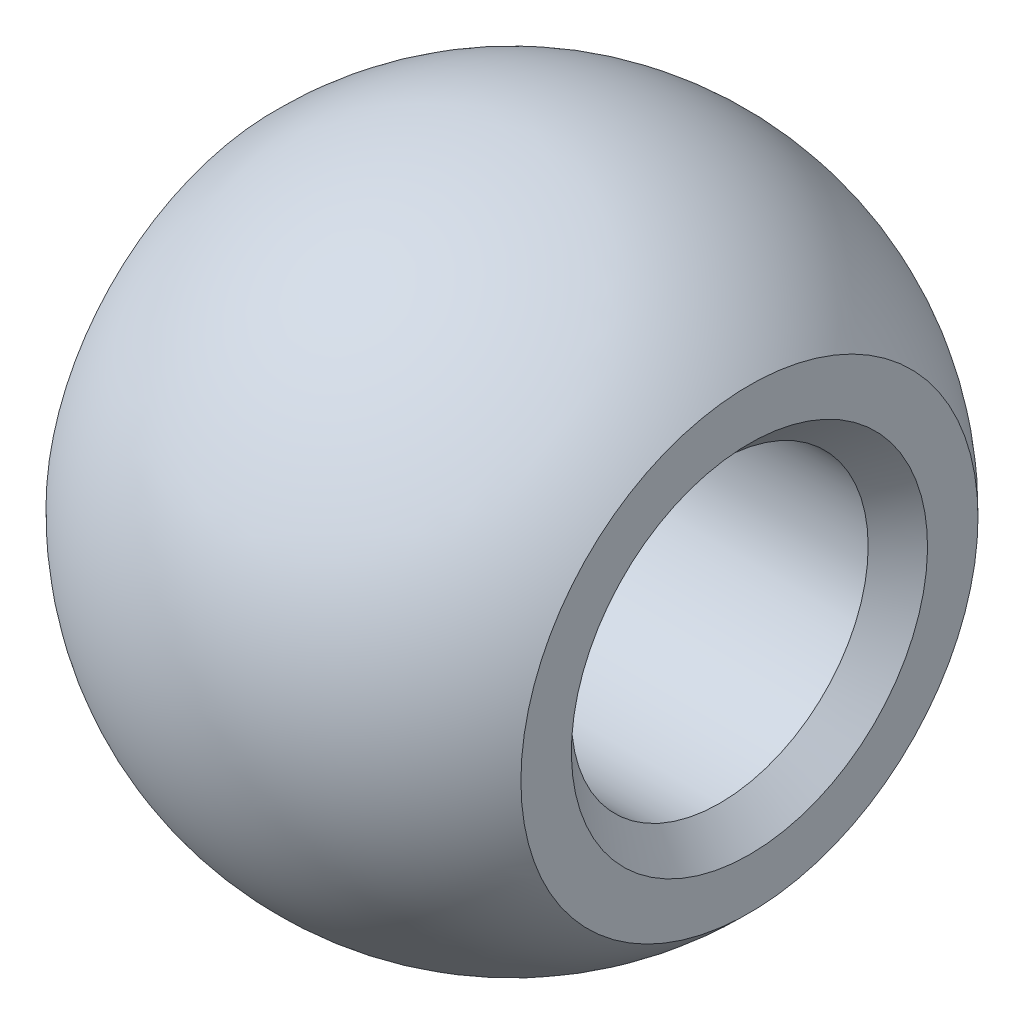
ISO-10303-21;
HEADER;
FILE_DESCRIPTION(('STEP AP214'),'2;1');
FILE_NAME('part.step','',(''),(''),'','','');
FILE_SCHEMA(('AUTOMOTIVE_DESIGN { 1 0 10303 214 1 1 1 1 }'));
ENDSEC;
DATA;
#1=APPLICATION_CONTEXT('core data for automotive mechanical design processes');
#2=APPLICATION_PROTOCOL_DEFINITION('international standard','automotive_design',2000,#1);
#3=PRODUCT_CONTEXT('',#1,'mechanical');
#4=PRODUCT('Part','Part','',(#3));
#5=PRODUCT_RELATED_PRODUCT_CATEGORY('part','',(#4));
#6=PRODUCT_DEFINITION_FORMATION('','',#4);
#7=PRODUCT_DEFINITION_CONTEXT('part definition',#1,'design');
#8=PRODUCT_DEFINITION('design','',#6,#7);
#9=PRODUCT_DEFINITION_SHAPE('','',#8);
#10=(LENGTH_UNIT() NAMED_UNIT(*) SI_UNIT(.MILLI.,.METRE.));
#11=(NAMED_UNIT(*) PLANE_ANGLE_UNIT() SI_UNIT($,.RADIAN.));
#12=(NAMED_UNIT(*) SI_UNIT($,.STERADIAN.) SOLID_ANGLE_UNIT());
#13=UNCERTAINTY_MEASURE_WITH_UNIT(LENGTH_MEASURE(1.E-05),#10,'distance_accuracy_value','');
#14=(GEOMETRIC_REPRESENTATION_CONTEXT(3) GLOBAL_UNCERTAINTY_ASSIGNED_CONTEXT((#13)) GLOBAL_UNIT_ASSIGNED_CONTEXT((#10,
#11,#12)) REPRESENTATION_CONTEXT('',''));
#15=CARTESIAN_POINT('',(0.,0.,0.));
#16=DIRECTION('',(0.,0.,1.));
#17=DIRECTION('',(1.,0.,0.));
#18=AXIS2_PLACEMENT_3D('',#15,#16,#17);
#19=CARTESIAN_POINT('',(3.75,0.,0.));
#20=DIRECTION('',(1.,0.,0.));
#21=DIRECTION('',(0.,1.,0.));
#22=AXIS2_PLACEMENT_3D('',#19,#20,#21);
#23=CONICAL_SURFACE('',#22,2.75,0.785398163397448);
#24=CARTESIAN_POINT('',(3.5,0.,0.));
#25=DIRECTION('',(-1.,0.,0.));
#26=DIRECTION('',(0.,1.,0.));
#27=AXIS2_PLACEMENT_3D('',#24,#25,#26);
#28=CIRCLE('',#27,2.5);
#29=CARTESIAN_POINT('',(3.5,-2.5,0.));
#30=VERTEX_POINT('',#29);
#31=EDGE_CURVE('E11',#30,#30,#28,.T.);
#32=ORIENTED_EDGE('',*,*,#31,.T.);
#33=EDGE_LOOP('',(#32));
#34=FACE_BOUND('',#33,.T.);
#35=CARTESIAN_POINT('',(4.,0.,0.));
#36=DIRECTION('',(1.,0.,0.));
#37=DIRECTION('',(0.,1.,0.));
#38=AXIS2_PLACEMENT_3D('',#35,#36,#37);
#39=CIRCLE('',#38,3.);
#40=CARTESIAN_POINT('',(4.,-3.,0.));
#41=VERTEX_POINT('',#40);
#42=EDGE_CURVE('E26',#41,#41,#39,.T.);
#43=ORIENTED_EDGE('',*,*,#42,.T.);
#44=EDGE_LOOP('',(#43));
#45=FACE_BOUND('',#44,.T.);
#46=ADVANCED_FACE('F16',(#34,#45),#23,.F.);
#47=CARTESIAN_POINT('',(3.,0.,0.));
#48=DIRECTION('',(1.,0.,0.));
#49=DIRECTION('',(0.,1.,0.));
#50=AXIS2_PLACEMENT_3D('',#47,#48,#49);
#51=CYLINDRICAL_SURFACE('',#50,2.5);
#52=CARTESIAN_POINT('',(-3.5,0.,0.));
#53=DIRECTION('',(1.,0.,0.));
#54=DIRECTION('',(0.,1.,0.));
#55=AXIS2_PLACEMENT_3D('',#52,#53,#54);
#56=CIRCLE('',#55,2.5);
#57=CARTESIAN_POINT('',(-3.5,-2.5,0.));
#58=VERTEX_POINT('',#57);
#59=EDGE_CURVE('E44',#58,#58,#56,.T.);
#60=ORIENTED_EDGE('',*,*,#59,.F.);
#61=EDGE_LOOP('',(#60));
#62=FACE_BOUND('',#61,.T.);
#63=ORIENTED_EDGE('',*,*,#31,.F.);
#64=EDGE_LOOP('',(#63));
#65=FACE_BOUND('',#64,.T.);
#66=ADVANCED_FACE('F45',(#62,#65),#51,.F.);
#67=CARTESIAN_POINT('',(4.,5.55180150942017,0.));
#68=DIRECTION('',(-1.,0.,0.));
#69=DIRECTION('',(0.,-1.,0.));
#70=AXIS2_PLACEMENT_3D('',#67,#68,#69);
#71=PLANE('',#70);
#72=CARTESIAN_POINT('',(4.,0.,0.));
#73=DIRECTION('',(-1.,0.,0.));
#74=DIRECTION('',(0.,0.,-1.));
#75=AXIS2_PLACEMENT_3D('',#72,#73,#74);
#76=CIRCLE('',#75,3.85);
#77=CARTESIAN_POINT('',(4.,0.,3.85));
#78=VERTEX_POINT('',#77);
#79=EDGE_CURVE('E20',#78,#78,#76,.T.);
#80=ORIENTED_EDGE('',*,*,#79,.F.);
#81=EDGE_LOOP('',(#80));
#82=FACE_BOUND('',#81,.T.);
#83=ORIENTED_EDGE('',*,*,#42,.F.);
#84=EDGE_LOOP('',(#83));
#85=FACE_BOUND('',#84,.T.);
#86=ADVANCED_FACE('F18',(#82,#85),#71,.F.);
#87=CARTESIAN_POINT('',(-3.75,0.,0.));
#88=DIRECTION('',(-1.,0.,0.));
#89=DIRECTION('',(0.,1.,0.));
#90=AXIS2_PLACEMENT_3D('',#87,#88,#89);
#91=CONICAL_SURFACE('',#90,2.75,0.785398163397448);
#92=ORIENTED_EDGE('',*,*,#59,.T.);
#93=EDGE_LOOP('',(#92));
#94=FACE_BOUND('',#93,.T.);
#95=CARTESIAN_POINT('',(-4.,0.,0.));
#96=DIRECTION('',(-1.,0.,0.));
#97=DIRECTION('',(0.,1.,0.));
#98=AXIS2_PLACEMENT_3D('',#95,#96,#97);
#99=CIRCLE('',#98,3.);
#100=CARTESIAN_POINT('',(-4.,-3.,0.));
#101=VERTEX_POINT('',#100);
#102=EDGE_CURVE('E47',#101,#101,#99,.T.);
#103=ORIENTED_EDGE('',*,*,#102,.T.);
#104=EDGE_LOOP('',(#103));
#105=FACE_BOUND('',#104,.T.);
#106=ADVANCED_FACE('F63',(#94,#105),#91,.F.);
#107=CARTESIAN_POINT('',(-4.,5.55180150942017,0.));
#108=DIRECTION('',(-1.,0.,0.));
#109=DIRECTION('',(0.,-1.,0.));
#110=AXIS2_PLACEMENT_3D('',#107,#108,#109);
#111=PLANE('',#110);
#112=CARTESIAN_POINT('',(-4.,0.,0.));
#113=DIRECTION('',(1.,0.,0.));
#114=DIRECTION('',(0.,0.,1.));
#115=AXIS2_PLACEMENT_3D('',#112,#113,#114);
#116=CIRCLE('',#115,3.85);
#117=CARTESIAN_POINT('',(-4.,0.,-3.85));
#118=VERTEX_POINT('',#117);
#119=EDGE_CURVE('E52',#118,#118,#116,.T.);
#120=ORIENTED_EDGE('',*,*,#119,.F.);
#121=EDGE_LOOP('',(#120));
#122=FACE_BOUND('',#121,.T.);
#123=ORIENTED_EDGE('',*,*,#102,.F.);
#124=EDGE_LOOP('',(#123));
#125=FACE_BOUND('',#124,.T.);
#126=ADVANCED_FACE('F77',(#122,#125),#111,.T.);
#127=CARTESIAN_POINT('',(0.,0.,0.));
#128=DIRECTION('',(0.,0.,1.));
#129=DIRECTION('',(1.,0.,0.));
#130=AXIS2_PLACEMENT_3D('',#127,#128,#129);
#131=SPHERICAL_SURFACE('',#130,5.55180150942016);
#132=CARTESIAN_POINT('',(0.,0.,0.));
#133=DIRECTION('',(1.,0.,0.));
#134=DIRECTION('',(0.,0.,1.));
#135=AXIS2_PLACEMENT_3D('',#132,#133,#134);
#136=SPHERICAL_SURFACE('',#135,5.55180150942016);
#137=ORIENTED_EDGE('',*,*,#119,.T.);
#138=EDGE_LOOP('',(#137));
#139=FACE_BOUND('',#138,.T.);
#140=ORIENTED_EDGE('',*,*,#79,.T.);
#141=EDGE_LOOP('',(#140));
#142=FACE_BOUND('',#141,.T.);
#143=ADVANCED_FACE('F59',(#139,#142),#136,.T.);
#144=CLOSED_SHELL('',(#46,#66,#86,#106,#126,#143));
#145=MANIFOLD_SOLID_BREP('B1',#144);
#146=ADVANCED_BREP_SHAPE_REPRESENTATION('',(#18,#145),#14);
#147=SHAPE_DEFINITION_REPRESENTATION(#9,#146);
ENDSEC;
END-ISO-10303-21;
